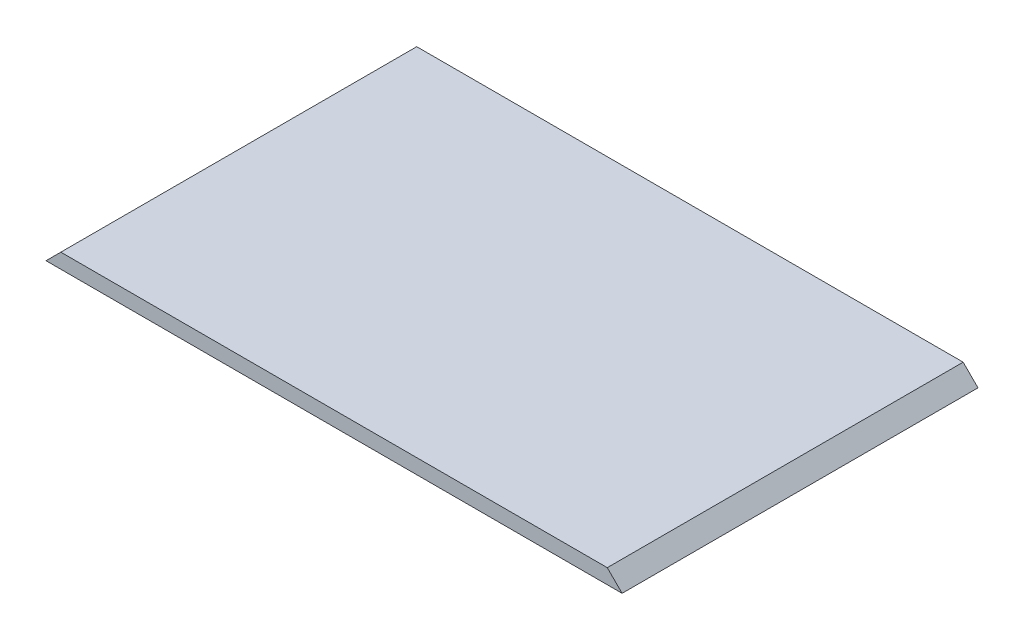
ISO-10303-21;
HEADER;
FILE_DESCRIPTION(('STEP AP214'),'2;1');
FILE_NAME('part.step','',(''),(''),'','','');
FILE_SCHEMA(('AUTOMOTIVE_DESIGN { 1 0 10303 214 1 1 1 1 }'));
ENDSEC;
DATA;
#1=APPLICATION_CONTEXT('core data for automotive mechanical design processes');
#2=APPLICATION_PROTOCOL_DEFINITION('international standard','automotive_design',2000,#1);
#3=PRODUCT_CONTEXT('',#1,'mechanical');
#4=PRODUCT('Part','Part','',(#3));
#5=PRODUCT_RELATED_PRODUCT_CATEGORY('part','',(#4));
#6=PRODUCT_DEFINITION_FORMATION('','',#4);
#7=PRODUCT_DEFINITION_CONTEXT('part definition',#1,'design');
#8=PRODUCT_DEFINITION('design','',#6,#7);
#9=PRODUCT_DEFINITION_SHAPE('','',#8);
#10=(LENGTH_UNIT() NAMED_UNIT(*) SI_UNIT(.MILLI.,.METRE.));
#11=(NAMED_UNIT(*) PLANE_ANGLE_UNIT() SI_UNIT($,.RADIAN.));
#12=(NAMED_UNIT(*) SI_UNIT($,.STERADIAN.) SOLID_ANGLE_UNIT());
#13=UNCERTAINTY_MEASURE_WITH_UNIT(LENGTH_MEASURE(1.E-05),#10,'distance_accuracy_value','');
#14=(GEOMETRIC_REPRESENTATION_CONTEXT(3) GLOBAL_UNCERTAINTY_ASSIGNED_CONTEXT((#13)) GLOBAL_UNIT_ASSIGNED_CONTEXT((#10,
#11,#12)) REPRESENTATION_CONTEXT('',''));
#15=CARTESIAN_POINT('',(0.,0.,0.));
#16=DIRECTION('',(0.,0.,1.));
#17=DIRECTION('',(1.,0.,0.));
#18=AXIS2_PLACEMENT_3D('',#15,#16,#17);
#19=CARTESIAN_POINT('',(-127.,3.175,-76.2));
#20=DIRECTION('',(0.,0.,-1.));
#21=DIRECTION('',(-1.,0.,0.));
#22=AXIS2_PLACEMENT_3D('',#19,#20,#21);
#23=PLANE('',#22);
#24=DIRECTION('',(1.,0.,0.));
#25=VECTOR('',#24,1.);
#26=CARTESIAN_POINT('',(-127.,3.175,-76.2));
#27=LINE('',#26,#25);
#28=CARTESIAN_POINT('',(-117.,3.175,-76.2));
#29=VERTEX_POINT('',#28);
#30=CARTESIAN_POINT('',(117.,3.175,-76.2));
#31=VERTEX_POINT('',#30);
#32=EDGE_CURVE('E99',#29,#31,#27,.T.);
#33=ORIENTED_EDGE('',*,*,#32,.T.);
#34=DIRECTION('',(0.707106781186551,-0.707106781186544,0.));
#35=VECTOR('',#34,1.);
#36=CARTESIAN_POINT('',(-5.00000000000135,125.175,-76.2));
#37=LINE('',#36,#35);
#38=CARTESIAN_POINT('',(123.35,-3.175,-76.2));
#39=VERTEX_POINT('',#38);
#40=EDGE_CURVE('E54',#31,#39,#37,.T.);
#41=ORIENTED_EDGE('',*,*,#40,.T.);
#42=DIRECTION('',(1.,0.,0.));
#43=VECTOR('',#42,1.);
#44=CARTESIAN_POINT('',(-127.,-3.175,-76.2));
#45=LINE('',#44,#43);
#46=CARTESIAN_POINT('',(-123.35,-3.175,-76.2));
#47=VERTEX_POINT('',#46);
#48=EDGE_CURVE('E73',#47,#39,#45,.T.);
#49=ORIENTED_EDGE('',*,*,#48,.F.);
#50=DIRECTION('',(-0.707106781186544,-0.707106781186551,0.));
#51=VECTOR('',#50,1.);
#52=CARTESIAN_POINT('',(-122.,-1.82500000000003,-76.2));
#53=LINE('',#52,#51);
#54=EDGE_CURVE('E77',#47,#29,#53,.F.);
#55=ORIENTED_EDGE('',*,*,#54,.T.);
#56=EDGE_LOOP('',(#33,#41,#49,#55));
#57=FACE_BOUND('',#56,.T.);
#58=ADVANCED_FACE('F32',(#57),#23,.T.);
#59=CARTESIAN_POINT('',(-127.,3.175,76.2));
#60=DIRECTION('',(0.,0.,-1.));
#61=DIRECTION('',(-1.,0.,0.));
#62=AXIS2_PLACEMENT_3D('',#59,#60,#61);
#63=PLANE('',#62);
#64=DIRECTION('',(1.,0.,0.));
#65=VECTOR('',#64,1.);
#66=CARTESIAN_POINT('',(-127.,-3.175,76.2));
#67=LINE('',#66,#65);
#68=CARTESIAN_POINT('',(-123.35,-3.175,76.2));
#69=VERTEX_POINT('',#68);
#70=CARTESIAN_POINT('',(123.35,-3.175,76.2));
#71=VERTEX_POINT('',#70);
#72=EDGE_CURVE('E74',#69,#71,#67,.T.);
#73=ORIENTED_EDGE('',*,*,#72,.T.);
#74=DIRECTION('',(-0.707106781186551,0.707106781186544,0.));
#75=VECTOR('',#74,1.);
#76=CARTESIAN_POINT('',(117.,3.175,76.2));
#77=LINE('',#76,#75);
#78=CARTESIAN_POINT('',(117.,3.175,76.2));
#79=VERTEX_POINT('',#78);
#80=EDGE_CURVE('E11',#71,#79,#77,.T.);
#81=ORIENTED_EDGE('',*,*,#80,.T.);
#82=DIRECTION('',(1.,0.,0.));
#83=VECTOR('',#82,1.);
#84=CARTESIAN_POINT('',(-127.,3.175,76.2));
#85=LINE('',#84,#83);
#86=CARTESIAN_POINT('',(-117.,3.175,76.2));
#87=VERTEX_POINT('',#86);
#88=EDGE_CURVE('E78',#87,#79,#85,.T.);
#89=ORIENTED_EDGE('',*,*,#88,.F.);
#90=DIRECTION('',(0.707106781186544,0.707106781186551,0.));
#91=VECTOR('',#90,1.);
#92=CARTESIAN_POINT('',(-127.,-6.82500000000018,76.2));
#93=LINE('',#92,#91);
#94=EDGE_CURVE('E87',#87,#69,#93,.F.);
#95=ORIENTED_EDGE('',*,*,#94,.T.);
#96=EDGE_LOOP('',(#73,#81,#89,#95));
#97=FACE_BOUND('',#96,.T.);
#98=ADVANCED_FACE('F106',(#97),#63,.F.);
#99=CARTESIAN_POINT('',(0.,3.175,0.));
#100=DIRECTION('',(0.,1.,0.));
#101=DIRECTION('',(0.,0.,1.));
#102=AXIS2_PLACEMENT_3D('',#99,#100,#101);
#103=PLANE('',#102);
#104=ORIENTED_EDGE('',*,*,#88,.T.);
#105=DIRECTION('',(0.,0.,-1.));
#106=VECTOR('',#105,1.);
#107=CARTESIAN_POINT('',(117.,3.175,-76.2));
#108=LINE('',#107,#106);
#109=EDGE_CURVE('E92',#79,#31,#108,.T.);
#110=ORIENTED_EDGE('',*,*,#109,.T.);
#111=ORIENTED_EDGE('',*,*,#32,.F.);
#112=DIRECTION('',(0.,0.,1.));
#113=VECTOR('',#112,1.);
#114=CARTESIAN_POINT('',(-117.,3.175,0.));
#115=LINE('',#114,#113);
#116=EDGE_CURVE('E85',#29,#87,#115,.T.);
#117=ORIENTED_EDGE('',*,*,#116,.T.);
#118=EDGE_LOOP('',(#104,#110,#111,#117));
#119=FACE_BOUND('',#118,.T.);
#120=ADVANCED_FACE('F98',(#119),#103,.T.);
#121=CARTESIAN_POINT('',(0.,-3.175,0.));
#122=DIRECTION('',(0.,1.,0.));
#123=DIRECTION('',(0.,0.,1.));
#124=AXIS2_PLACEMENT_3D('',#121,#122,#123);
#125=PLANE('',#124);
#126=ORIENTED_EDGE('',*,*,#48,.T.);
#127=DIRECTION('',(0.,0.,1.));
#128=VECTOR('',#127,1.);
#129=CARTESIAN_POINT('',(123.35,-3.175,0.));
#130=LINE('',#129,#128);
#131=EDGE_CURVE('E40',#39,#71,#130,.T.);
#132=ORIENTED_EDGE('',*,*,#131,.T.);
#133=ORIENTED_EDGE('',*,*,#72,.F.);
#134=DIRECTION('',(0.,0.,1.));
#135=VECTOR('',#134,1.);
#136=CARTESIAN_POINT('',(-123.35,-3.175,76.2));
#137=LINE('',#136,#135);
#138=EDGE_CURVE('E71',#69,#47,#137,.F.);
#139=ORIENTED_EDGE('',*,*,#138,.T.);
#140=EDGE_LOOP('',(#126,#132,#133,#139));
#141=FACE_BOUND('',#140,.T.);
#142=ADVANCED_FACE('F72',(#141),#125,.F.);
#143=CARTESIAN_POINT('',(-127.,-6.82500000000018,76.2));
#144=DIRECTION('',(0.707106781186551,-0.707106781186544,0.));
#145=DIRECTION('',(0.,0.,-1.));
#146=AXIS2_PLACEMENT_3D('',#143,#144,#145);
#147=PLANE('',#146);
#148=ORIENTED_EDGE('',*,*,#94,.F.);
#149=ORIENTED_EDGE('',*,*,#116,.F.);
#150=ORIENTED_EDGE('',*,*,#54,.F.);
#151=ORIENTED_EDGE('',*,*,#138,.F.);
#152=EDGE_LOOP('',(#148,#149,#150,#151));
#153=FACE_BOUND('',#152,.T.);
#154=ADVANCED_FACE('F83',(#153),#147,.F.);
#155=CARTESIAN_POINT('',(117.,3.175,0.));
#156=DIRECTION('',(0.707106781186544,0.707106781186551,0.));
#157=DIRECTION('',(0.,0.,1.));
#158=AXIS2_PLACEMENT_3D('',#155,#156,#157);
#159=PLANE('',#158);
#160=ORIENTED_EDGE('',*,*,#80,.F.);
#161=ORIENTED_EDGE('',*,*,#131,.F.);
#162=ORIENTED_EDGE('',*,*,#40,.F.);
#163=ORIENTED_EDGE('',*,*,#109,.F.);
#164=EDGE_LOOP('',(#160,#161,#162,#163));
#165=FACE_BOUND('',#164,.T.);
#166=ADVANCED_FACE('F34',(#165),#159,.T.);
#167=CLOSED_SHELL('',(#58,#98,#120,#142,#154,#166));
#168=MANIFOLD_SOLID_BREP('B2',#167);
#169=ADVANCED_BREP_SHAPE_REPRESENTATION('',(#18,#168),#14);
#170=SHAPE_DEFINITION_REPRESENTATION(#9,#169);
ENDSEC;
END-ISO-10303-21;
